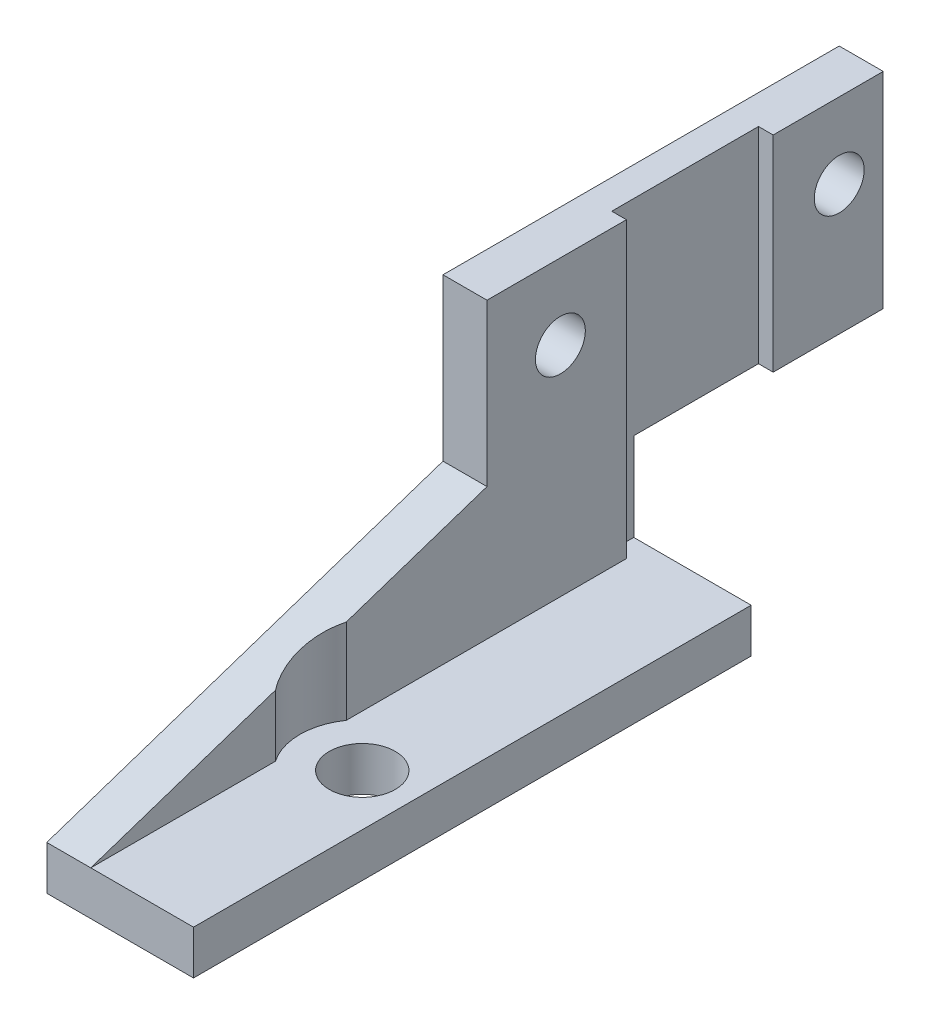
ISO-10303-21;
HEADER;
FILE_DESCRIPTION(('STEP AP214'),'2;1');
FILE_NAME('part.step','',(''),(''),'','','');
FILE_SCHEMA(('AUTOMOTIVE_DESIGN { 1 0 10303 214 1 1 1 1 }'));
ENDSEC;
DATA;
#1=APPLICATION_CONTEXT('core data for automotive mechanical design processes');
#2=APPLICATION_PROTOCOL_DEFINITION('international standard','automotive_design',2000,#1);
#3=PRODUCT_CONTEXT('',#1,'mechanical');
#4=PRODUCT('Part','Part','',(#3));
#5=PRODUCT_RELATED_PRODUCT_CATEGORY('part','',(#4));
#6=PRODUCT_DEFINITION_FORMATION('','',#4);
#7=PRODUCT_DEFINITION_CONTEXT('part definition',#1,'design');
#8=PRODUCT_DEFINITION('design','',#6,#7);
#9=PRODUCT_DEFINITION_SHAPE('','',#8);
#10=(LENGTH_UNIT() NAMED_UNIT(*) SI_UNIT(.MILLI.,.METRE.));
#11=(NAMED_UNIT(*) PLANE_ANGLE_UNIT() SI_UNIT($,.RADIAN.));
#12=(NAMED_UNIT(*) SI_UNIT($,.STERADIAN.) SOLID_ANGLE_UNIT());
#13=UNCERTAINTY_MEASURE_WITH_UNIT(LENGTH_MEASURE(1.E-05),#10,'distance_accuracy_value','');
#14=(GEOMETRIC_REPRESENTATION_CONTEXT(3) GLOBAL_UNCERTAINTY_ASSIGNED_CONTEXT((#13)) GLOBAL_UNIT_ASSIGNED_CONTEXT((#10,
#11,#12)) REPRESENTATION_CONTEXT('',''));
#15=CARTESIAN_POINT('',(0.,0.,0.));
#16=DIRECTION('',(0.,0.,1.));
#17=DIRECTION('',(1.,0.,0.));
#18=AXIS2_PLACEMENT_3D('',#15,#16,#17);
#19=CARTESIAN_POINT('',(3.,20.,27.));
#20=DIRECTION('',(-1.,0.,0.));
#21=DIRECTION('',(0.,-1.,0.));
#22=AXIS2_PLACEMENT_3D('',#19,#20,#21);
#23=PLANE('',#22);
#24=CARTESIAN_POINT('',(3.,14.85,22.));
#25=DIRECTION('',(1.,0.,0.));
#26=DIRECTION('',(0.,1.,0.));
#27=AXIS2_PLACEMENT_3D('',#24,#25,#26);
#28=CIRCLE('',#27,1.7);
#29=CARTESIAN_POINT('',(3.,16.55,22.));
#30=VERTEX_POINT('',#29);
#31=EDGE_CURVE('E236',#30,#30,#28,.T.);
#32=ORIENTED_EDGE('',*,*,#31,.F.);
#33=EDGE_LOOP('',(#32));
#34=FACE_BOUND('',#33,.T.);
#35=DIRECTION('',(0.,-1.,0.));
#36=VECTOR('',#35,1.);
#37=CARTESIAN_POINT('',(3.,20.,36.5890873097518));
#38=LINE('',#37,#36);
#39=CARTESIAN_POINT('',(2.99999999999999,0.,36.5890873097518));
#40=VERTEX_POINT('',#39);
#41=CARTESIAN_POINT('',(3.,5.80363756341608,36.5890873097518));
#42=VERTEX_POINT('',#41);
#43=EDGE_CURVE('E56',#40,#42,#38,.F.);
#44=ORIENTED_EDGE('',*,*,#43,.F.);
#45=DIRECTION('',(0.,0.,-1.));
#46=VECTOR('',#45,1.);
#47=CARTESIAN_POINT('',(2.99999999999999,0.,27.));
#48=LINE('',#47,#46);
#49=CARTESIAN_POINT('',(2.99999999999999,0.,17.5));
#50=VERTEX_POINT('',#49);
#51=EDGE_CURVE('E180',#40,#50,#48,.T.);
#52=ORIENTED_EDGE('',*,*,#51,.T.);
#53=DIRECTION('',(0.,-1.,0.));
#54=VECTOR('',#53,1.);
#55=CARTESIAN_POINT('',(3.,20.,17.5));
#56=LINE('',#55,#54);
#57=CARTESIAN_POINT('',(3.,20.,17.5));
#58=VERTEX_POINT('',#57);
#59=EDGE_CURVE('E221',#58,#50,#56,.T.);
#60=ORIENTED_EDGE('',*,*,#59,.F.);
#61=DIRECTION('',(0.,0.,-1.));
#62=VECTOR('',#61,1.);
#63=CARTESIAN_POINT('',(3.,20.,27.));
#64=LINE('',#63,#62);
#65=CARTESIAN_POINT('',(3.,20.,27.));
#66=VERTEX_POINT('',#65);
#67=EDGE_CURVE('E177',#66,#58,#64,.T.);
#68=ORIENTED_EDGE('',*,*,#67,.F.);
#69=DIRECTION('',(0.,1.,0.));
#70=VECTOR('',#69,1.);
#71=CARTESIAN_POINT('',(3.,20.,27.));
#72=LINE('',#71,#70);
#73=CARTESIAN_POINT('',(3.,9.,27.));
#74=VERTEX_POINT('',#73);
#75=EDGE_CURVE('E169',#74,#66,#72,.T.);
#76=ORIENTED_EDGE('',*,*,#75,.F.);
#77=DIRECTION('',(0.,-0.316227766016838,0.948683298050514));
#78=VECTOR('',#77,1.);
#79=CARTESIAN_POINT('',(3.,9.,27.));
#80=LINE('',#79,#78);
#81=EDGE_CURVE('E224',#74,#42,#80,.T.);
#82=ORIENTED_EDGE('',*,*,#81,.T.);
#83=EDGE_LOOP('',(#44,#52,#60,#68,#76,#82));
#84=FACE_BOUND('',#83,.T.);
#85=ADVANCED_FACE('F33',(#34,#84),#23,.F.);
#86=DIRECTION('',(0.,-1.,0.));
#87=VECTOR('',#86,1.);
#88=CARTESIAN_POINT('',(3.,20.,41.4109126902482));
#89=LINE('',#88,#87);
#90=CARTESIAN_POINT('',(3.,4.19636243658392,41.4109126902482));
#91=VERTEX_POINT('',#90);
#92=CARTESIAN_POINT('',(2.99999999999999,0.,41.4109126902482));
#93=VERTEX_POINT('',#92);
#94=EDGE_CURVE('E269',#91,#93,#89,.T.);
#95=ORIENTED_EDGE('',*,*,#94,.F.);
#96=CARTESIAN_POINT('',(2.99999999999999,0.,54.));
#97=VERTEX_POINT('',#96);
#98=EDGE_CURVE('E287',#91,#97,#80,.T.);
#99=ORIENTED_EDGE('',*,*,#98,.T.);
#100=EDGE_CURVE('E181',#97,#93,#48,.T.);
#101=ORIENTED_EDGE('',*,*,#100,.T.);
#102=EDGE_LOOP('',(#95,#99,#101));
#103=FACE_BOUND('',#102,.T.);
#104=ADVANCED_FACE('F327',(#103),#23,.F.);
#105=CARTESIAN_POINT('',(0.,0.,27.));
#106=DIRECTION('',(0.,0.,-1.));
#107=DIRECTION('',(-1.,0.,0.));
#108=AXIS2_PLACEMENT_3D('',#105,#106,#107);
#109=PLANE('',#108);
#110=DIRECTION('',(-1.,0.,0.));
#111=VECTOR('',#110,1.);
#112=CARTESIAN_POINT('',(32.5465734053883,9.,27.));
#113=LINE('',#112,#111);
#114=CARTESIAN_POINT('',(0.,9.,27.));
#115=VERTEX_POINT('',#114);
#116=EDGE_CURVE('E294',#74,#115,#113,.T.);
#117=ORIENTED_EDGE('',*,*,#116,.F.);
#118=ORIENTED_EDGE('',*,*,#75,.T.);
#119=DIRECTION('',(-1.,0.,0.));
#120=VECTOR('',#119,1.);
#121=CARTESIAN_POINT('',(0.,20.,27.));
#122=LINE('',#121,#120);
#123=CARTESIAN_POINT('',(0.,20.,27.));
#124=VERTEX_POINT('',#123);
#125=EDGE_CURVE('E176',#66,#124,#122,.T.);
#126=ORIENTED_EDGE('',*,*,#125,.T.);
#127=DIRECTION('',(0.,-1.,0.));
#128=VECTOR('',#127,1.);
#129=CARTESIAN_POINT('',(0.,-3.,27.));
#130=LINE('',#129,#128);
#131=EDGE_CURVE('E166',#124,#115,#130,.T.);
#132=ORIENTED_EDGE('',*,*,#131,.T.);
#133=EDGE_LOOP('',(#117,#118,#126,#132));
#134=FACE_BOUND('',#133,.T.);
#135=ADVANCED_FACE('F313',(#134),#109,.F.);
#136=CARTESIAN_POINT('',(10.,-3.,27.));
#137=DIRECTION('',(0.,1.,0.));
#138=DIRECTION('',(0.,0.,1.));
#139=AXIS2_PLACEMENT_3D('',#136,#137,#138);
#140=PLANE('',#139);
#141=CARTESIAN_POINT('',(6.5,-3.,39.));
#142=DIRECTION('',(0.,1.,0.));
#143=DIRECTION('',(0.,0.,1.));
#144=AXIS2_PLACEMENT_3D('',#141,#142,#143);
#145=CIRCLE('',#144,2.25);
#146=CARTESIAN_POINT('',(6.5,-3.,41.25));
#147=VERTEX_POINT('',#146);
#148=EDGE_CURVE('E273',#147,#147,#145,.T.);
#149=ORIENTED_EDGE('',*,*,#148,.T.);
#150=EDGE_LOOP('',(#149));
#151=FACE_BOUND('',#150,.T.);
#152=DIRECTION('',(0.,0.,-1.));
#153=VECTOR('',#152,1.);
#154=CARTESIAN_POINT('',(0.,-3.,27.));
#155=LINE('',#154,#153);
#156=CARTESIAN_POINT('',(0.,-3.,54.));
#157=VERTEX_POINT('',#156);
#158=CARTESIAN_POINT('',(0.,-3.00000000000001,16.));
#159=VERTEX_POINT('',#158);
#160=EDGE_CURVE('E190',#157,#159,#155,.T.);
#161=ORIENTED_EDGE('',*,*,#160,.T.);
#162=DIRECTION('',(1.,0.,0.));
#163=VECTOR('',#162,1.);
#164=CARTESIAN_POINT('',(0.,-3.00000000000001,16.));
#165=LINE('',#164,#163);
#166=CARTESIAN_POINT('',(10.,-3.,16.));
#167=VERTEX_POINT('',#166);
#168=EDGE_CURVE('E200',#159,#167,#165,.T.);
#169=ORIENTED_EDGE('',*,*,#168,.T.);
#170=DIRECTION('',(0.,0.,-1.));
#171=VECTOR('',#170,1.);
#172=CARTESIAN_POINT('',(10.,-3.,27.));
#173=LINE('',#172,#171);
#174=CARTESIAN_POINT('',(10.,-3.,54.));
#175=VERTEX_POINT('',#174);
#176=EDGE_CURVE('E187',#175,#167,#173,.T.);
#177=ORIENTED_EDGE('',*,*,#176,.F.);
#178=DIRECTION('',(-1.,0.,0.));
#179=VECTOR('',#178,1.);
#180=CARTESIAN_POINT('',(32.5465734053883,-3.,54.));
#181=LINE('',#180,#179);
#182=EDGE_CURVE('E293',#175,#157,#181,.T.);
#183=ORIENTED_EDGE('',*,*,#182,.T.);
#184=EDGE_LOOP('',(#161,#169,#177,#183));
#185=FACE_BOUND('',#184,.T.);
#186=ADVANCED_FACE('F35',(#151,#185),#140,.F.);
#187=CARTESIAN_POINT('',(10.,0.,27.));
#188=DIRECTION('',(-1.,0.,0.));
#189=DIRECTION('',(0.,-1.,0.));
#190=AXIS2_PLACEMENT_3D('',#187,#188,#189);
#191=PLANE('',#190);
#192=ORIENTED_EDGE('',*,*,#176,.T.);
#193=DIRECTION('',(0.,-1.,0.));
#194=VECTOR('',#193,1.);
#195=CARTESIAN_POINT('',(10.,-3.,16.));
#196=LINE('',#195,#194);
#197=CARTESIAN_POINT('',(10.,0.,16.));
#198=VERTEX_POINT('',#197);
#199=EDGE_CURVE('E152',#198,#167,#196,.T.);
#200=ORIENTED_EDGE('',*,*,#199,.F.);
#201=DIRECTION('',(0.,0.,-1.));
#202=VECTOR('',#201,1.);
#203=CARTESIAN_POINT('',(10.,0.,27.));
#204=LINE('',#203,#202);
#205=CARTESIAN_POINT('',(10.,0.,54.));
#206=VERTEX_POINT('',#205);
#207=EDGE_CURVE('E184',#206,#198,#204,.T.);
#208=ORIENTED_EDGE('',*,*,#207,.F.);
#209=DIRECTION('',(0.,1.,0.));
#210=VECTOR('',#209,1.);
#211=CARTESIAN_POINT('',(10.,0.,54.));
#212=LINE('',#211,#210);
#213=EDGE_CURVE('E276',#175,#206,#212,.T.);
#214=ORIENTED_EDGE('',*,*,#213,.F.);
#215=EDGE_LOOP('',(#192,#200,#208,#214));
#216=FACE_BOUND('',#215,.T.);
#217=ADVANCED_FACE('F358',(#216),#191,.F.);
#218=CARTESIAN_POINT('',(2.99999999999999,0.,27.));
#219=DIRECTION('',(0.,-1.,0.));
#220=DIRECTION('',(0.,0.,-1.));
#221=AXIS2_PLACEMENT_3D('',#218,#219,#220);
#222=PLANE('',#221);
#223=ORIENTED_EDGE('',*,*,#207,.T.);
#224=DIRECTION('',(-1.,0.,0.));
#225=VECTOR('',#224,1.);
#226=CARTESIAN_POINT('',(2.99999999999999,0.,16.));
#227=LINE('',#226,#225);
#228=CARTESIAN_POINT('',(1.99999999999999,0.,16.));
#229=VERTEX_POINT('',#228);
#230=EDGE_CURVE('E260',#198,#229,#227,.T.);
#231=ORIENTED_EDGE('',*,*,#230,.T.);
#232=DIRECTION('',(0.,0.,-1.));
#233=VECTOR('',#232,1.);
#234=CARTESIAN_POINT('',(1.99999999999999,0.,17.5));
#235=LINE('',#234,#233);
#236=CARTESIAN_POINT('',(1.99999999999999,0.,17.5));
#237=VERTEX_POINT('',#236);
#238=EDGE_CURVE('E206',#237,#229,#235,.T.);
#239=ORIENTED_EDGE('',*,*,#238,.F.);
#240=DIRECTION('',(1.,0.,0.));
#241=VECTOR('',#240,1.);
#242=CARTESIAN_POINT('',(1.99999999999999,0.,17.5));
#243=LINE('',#242,#241);
#244=EDGE_CURVE('E220',#237,#50,#243,.T.);
#245=ORIENTED_EDGE('',*,*,#244,.T.);
#246=ORIENTED_EDGE('',*,*,#51,.F.);
#247=CARTESIAN_POINT('',(6.5,0.,39.));
#248=DIRECTION('',(0.,1.,0.));
#249=DIRECTION('',(0.,0.,1.));
#250=AXIS2_PLACEMENT_3D('',#247,#248,#249);
#251=CIRCLE('',#250,4.25);
#252=EDGE_CURVE('E266',#40,#93,#251,.T.);
#253=ORIENTED_EDGE('',*,*,#252,.T.);
#254=ORIENTED_EDGE('',*,*,#100,.F.);
#255=DIRECTION('',(-1.,0.,0.));
#256=VECTOR('',#255,1.);
#257=CARTESIAN_POINT('',(10.,0.,54.));
#258=LINE('',#257,#256);
#259=EDGE_CURVE('E279',#206,#97,#258,.T.);
#260=ORIENTED_EDGE('',*,*,#259,.F.);
#261=EDGE_LOOP('',(#223,#231,#239,#245,#246,#253,#254,#260));
#262=FACE_BOUND('',#261,.T.);
#263=CARTESIAN_POINT('',(6.5,0.,39.));
#264=DIRECTION('',(0.,1.,0.));
#265=DIRECTION('',(0.,0.,1.));
#266=AXIS2_PLACEMENT_3D('',#263,#264,#265);
#267=CIRCLE('',#266,2.25);
#268=CARTESIAN_POINT('',(6.5,0.,41.25));
#269=VERTEX_POINT('',#268);
#270=EDGE_CURVE('E272',#269,#269,#267,.T.);
#271=ORIENTED_EDGE('',*,*,#270,.F.);
#272=EDGE_LOOP('',(#271));
#273=FACE_BOUND('',#272,.T.);
#274=ADVANCED_FACE('F321',(#262,#273),#222,.F.);
#275=CARTESIAN_POINT('',(3.,14.85,3.));
#276=DIRECTION('',(1.,0.,0.));
#277=DIRECTION('',(0.,1.,0.));
#278=AXIS2_PLACEMENT_3D('',#275,#276,#277);
#279=CIRCLE('',#278,1.7);
#280=CARTESIAN_POINT('',(3.,16.55,3.));
#281=VERTEX_POINT('',#280);
#282=EDGE_CURVE('E228',#281,#281,#279,.T.);
#283=ORIENTED_EDGE('',*,*,#282,.F.);
#284=EDGE_LOOP('',(#283));
#285=FACE_BOUND('',#284,.T.);
#286=DIRECTION('',(0.,1.,0.));
#287=VECTOR('',#286,1.);
#288=CARTESIAN_POINT('',(3.,20.,7.5));
#289=LINE('',#288,#287);
#290=CARTESIAN_POINT('',(3.,6.,7.49999999999999));
#291=VERTEX_POINT('',#290);
#292=CARTESIAN_POINT('',(3.,20.,7.5));
#293=VERTEX_POINT('',#292);
#294=EDGE_CURVE('E215',#291,#293,#289,.T.);
#295=ORIENTED_EDGE('',*,*,#294,.F.);
#296=DIRECTION('',(0.,0.,-1.));
#297=VECTOR('',#296,1.);
#298=CARTESIAN_POINT('',(3.,5.99999999999999,27.));
#299=LINE('',#298,#297);
#300=CARTESIAN_POINT('',(3.,6.,0.));
#301=VERTEX_POINT('',#300);
#302=EDGE_CURVE('E251',#291,#301,#299,.T.);
#303=ORIENTED_EDGE('',*,*,#302,.T.);
#304=DIRECTION('',(0.,1.,0.));
#305=VECTOR('',#304,1.);
#306=CARTESIAN_POINT('',(3.,20.,0.));
#307=LINE('',#306,#305);
#308=CARTESIAN_POINT('',(3.,20.,0.));
#309=VERTEX_POINT('',#308);
#310=EDGE_CURVE('E160',#301,#309,#307,.T.);
#311=ORIENTED_EDGE('',*,*,#310,.T.);
#312=EDGE_CURVE('E175',#293,#309,#64,.T.);
#313=ORIENTED_EDGE('',*,*,#312,.F.);
#314=EDGE_LOOP('',(#295,#303,#311,#313));
#315=FACE_BOUND('',#314,.T.);
#316=ADVANCED_FACE('F250',(#285,#315),#23,.F.);
#317=CARTESIAN_POINT('',(0.,20.,27.));
#318=DIRECTION('',(0.,-1.,0.));
#319=DIRECTION('',(0.,0.,-1.));
#320=AXIS2_PLACEMENT_3D('',#317,#318,#319);
#321=PLANE('',#320);
#322=ORIENTED_EDGE('',*,*,#67,.T.);
#323=DIRECTION('',(1.,0.,0.));
#324=VECTOR('',#323,1.);
#325=CARTESIAN_POINT('',(2.,20.,17.5));
#326=LINE('',#325,#324);
#327=CARTESIAN_POINT('',(2.,20.,17.5));
#328=VERTEX_POINT('',#327);
#329=EDGE_CURVE('E226',#328,#58,#326,.T.);
#330=ORIENTED_EDGE('',*,*,#329,.F.);
#331=DIRECTION('',(0.,0.,1.));
#332=VECTOR('',#331,1.);
#333=CARTESIAN_POINT('',(2.,20.,17.5));
#334=LINE('',#333,#332);
#335=CARTESIAN_POINT('',(2.,20.,7.5));
#336=VERTEX_POINT('',#335);
#337=EDGE_CURVE('E213',#336,#328,#334,.T.);
#338=ORIENTED_EDGE('',*,*,#337,.F.);
#339=DIRECTION('',(1.,0.,0.));
#340=VECTOR('',#339,1.);
#341=CARTESIAN_POINT('',(2.,20.,7.5));
#342=LINE('',#341,#340);
#343=EDGE_CURVE('E229',#336,#293,#342,.T.);
#344=ORIENTED_EDGE('',*,*,#343,.T.);
#345=ORIENTED_EDGE('',*,*,#312,.T.);
#346=DIRECTION('',(-1.,0.,0.));
#347=VECTOR('',#346,1.);
#348=CARTESIAN_POINT('',(0.,20.,0.));
#349=LINE('',#348,#347);
#350=CARTESIAN_POINT('',(0.,20.,0.));
#351=VERTEX_POINT('',#350);
#352=EDGE_CURVE('E167',#309,#351,#349,.T.);
#353=ORIENTED_EDGE('',*,*,#352,.T.);
#354=DIRECTION('',(0.,0.,-1.));
#355=VECTOR('',#354,1.);
#356=CARTESIAN_POINT('',(0.,20.,27.));
#357=LINE('',#356,#355);
#358=EDGE_CURVE('E165',#124,#351,#357,.T.);
#359=ORIENTED_EDGE('',*,*,#358,.F.);
#360=ORIENTED_EDGE('',*,*,#125,.F.);
#361=EDGE_LOOP('',(#322,#330,#338,#344,#345,#353,#359,#360));
#362=FACE_BOUND('',#361,.T.);
#363=ADVANCED_FACE('F253',(#362),#321,.F.);
#364=CARTESIAN_POINT('',(0.,0.,27.));
#365=DIRECTION('',(1.,0.,0.));
#366=DIRECTION('',(0.,1.,0.));
#367=AXIS2_PLACEMENT_3D('',#364,#365,#366);
#368=PLANE('',#367);
#369=CARTESIAN_POINT('',(0.,14.85,22.));
#370=DIRECTION('',(1.,0.,0.));
#371=DIRECTION('',(0.,1.,0.));
#372=AXIS2_PLACEMENT_3D('',#369,#370,#371);
#373=CIRCLE('',#372,1.7);
#374=CARTESIAN_POINT('',(0.,16.55,22.));
#375=VERTEX_POINT('',#374);
#376=EDGE_CURVE('E233',#375,#375,#373,.T.);
#377=ORIENTED_EDGE('',*,*,#376,.T.);
#378=EDGE_LOOP('',(#377));
#379=FACE_BOUND('',#378,.T.);
#380=CARTESIAN_POINT('',(0.,14.85,3.));
#381=DIRECTION('',(1.,0.,0.));
#382=DIRECTION('',(0.,1.,0.));
#383=AXIS2_PLACEMENT_3D('',#380,#381,#382);
#384=CIRCLE('',#383,1.7);
#385=CARTESIAN_POINT('',(0.,16.55,3.));
#386=VERTEX_POINT('',#385);
#387=EDGE_CURVE('E239',#386,#386,#384,.T.);
#388=ORIENTED_EDGE('',*,*,#387,.T.);
#389=EDGE_LOOP('',(#388));
#390=FACE_BOUND('',#389,.T.);
#391=DIRECTION('',(0.,0.,1.));
#392=VECTOR('',#391,1.);
#393=CARTESIAN_POINT('',(0.,5.99999999999999,0.));
#394=LINE('',#393,#392);
#395=CARTESIAN_POINT('',(0.,5.99999999999999,0.));
#396=VERTEX_POINT('',#395);
#397=CARTESIAN_POINT('',(0.,5.99999999999999,16.));
#398=VERTEX_POINT('',#397);
#399=EDGE_CURVE('E140',#396,#398,#394,.T.);
#400=ORIENTED_EDGE('',*,*,#399,.T.);
#401=DIRECTION('',(0.,-1.,0.));
#402=VECTOR('',#401,1.);
#403=CARTESIAN_POINT('',(0.,-3.00000000000001,16.));
#404=LINE('',#403,#402);
#405=EDGE_CURVE('E151',#398,#159,#404,.T.);
#406=ORIENTED_EDGE('',*,*,#405,.T.);
#407=ORIENTED_EDGE('',*,*,#160,.F.);
#408=DIRECTION('',(0.,1.,0.));
#409=VECTOR('',#408,1.);
#410=CARTESIAN_POINT('',(0.,0.,54.));
#411=LINE('',#410,#409);
#412=CARTESIAN_POINT('',(0.,0.,54.));
#413=VERTEX_POINT('',#412);
#414=EDGE_CURVE('E282',#157,#413,#411,.T.);
#415=ORIENTED_EDGE('',*,*,#414,.T.);
#416=DIRECTION('',(0.,0.316227766016838,-0.948683298050514));
#417=VECTOR('',#416,1.);
#418=CARTESIAN_POINT('',(0.,9.,27.));
#419=LINE('',#418,#417);
#420=EDGE_CURVE('E290',#413,#115,#419,.T.);
#421=ORIENTED_EDGE('',*,*,#420,.T.);
#422=ORIENTED_EDGE('',*,*,#131,.F.);
#423=ORIENTED_EDGE('',*,*,#358,.T.);
#424=DIRECTION('',(0.,-1.,0.));
#425=VECTOR('',#424,1.);
#426=CARTESIAN_POINT('',(0.,0.,0.));
#427=LINE('',#426,#425);
#428=EDGE_CURVE('E159',#351,#396,#427,.T.);
#429=ORIENTED_EDGE('',*,*,#428,.T.);
#430=EDGE_LOOP('',(#400,#406,#407,#415,#421,#422,#423,#429));
#431=FACE_BOUND('',#430,.T.);
#432=ADVANCED_FACE('F163',(#379,#390,#431),#368,.F.);
#433=CARTESIAN_POINT('',(0.,0.,0.));
#434=DIRECTION('',(0.,0.,-1.));
#435=DIRECTION('',(-1.,0.,0.));
#436=AXIS2_PLACEMENT_3D('',#433,#434,#435);
#437=PLANE('',#436);
#438=DIRECTION('',(1.,0.,0.));
#439=VECTOR('',#438,1.);
#440=CARTESIAN_POINT('',(0.,5.99999999999999,0.));
#441=LINE('',#440,#439);
#442=EDGE_CURVE('E143',#396,#301,#441,.T.);
#443=ORIENTED_EDGE('',*,*,#442,.F.);
#444=ORIENTED_EDGE('',*,*,#428,.F.);
#445=ORIENTED_EDGE('',*,*,#352,.F.);
#446=ORIENTED_EDGE('',*,*,#310,.F.);
#447=EDGE_LOOP('',(#443,#444,#445,#446));
#448=FACE_BOUND('',#447,.T.);
#449=ADVANCED_FACE('F157',(#448),#437,.T.);
#450=CARTESIAN_POINT('',(0.,14.85,3.));
#451=DIRECTION('',(1.,0.,0.));
#452=DIRECTION('',(0.,1.,0.));
#453=AXIS2_PLACEMENT_3D('',#450,#451,#452);
#454=CYLINDRICAL_SURFACE('',#453,1.7);
#455=ORIENTED_EDGE('',*,*,#387,.F.);
#456=EDGE_LOOP('',(#455));
#457=FACE_BOUND('',#456,.T.);
#458=ORIENTED_EDGE('',*,*,#282,.T.);
#459=EDGE_LOOP('',(#458));
#460=FACE_BOUND('',#459,.T.);
#461=ADVANCED_FACE('F361',(#457,#460),#454,.F.);
#462=CARTESIAN_POINT('',(0.,14.85,22.));
#463=DIRECTION('',(1.,0.,0.));
#464=DIRECTION('',(0.,1.,0.));
#465=AXIS2_PLACEMENT_3D('',#462,#463,#464);
#466=CYLINDRICAL_SURFACE('',#465,1.7);
#467=ORIENTED_EDGE('',*,*,#376,.F.);
#468=EDGE_LOOP('',(#467));
#469=FACE_BOUND('',#468,.T.);
#470=ORIENTED_EDGE('',*,*,#31,.T.);
#471=EDGE_LOOP('',(#470));
#472=FACE_BOUND('',#471,.T.);
#473=ADVANCED_FACE('F363',(#469,#472),#466,.F.);
#474=CARTESIAN_POINT('',(2.,20.,17.5));
#475=DIRECTION('',(0.,0.,1.));
#476=DIRECTION('',(0.,-1.,0.));
#477=AXIS2_PLACEMENT_3D('',#474,#475,#476);
#478=PLANE('',#477);
#479=ORIENTED_EDGE('',*,*,#59,.T.);
#480=ORIENTED_EDGE('',*,*,#244,.F.);
#481=DIRECTION('',(0.,-1.,0.));
#482=VECTOR('',#481,1.);
#483=CARTESIAN_POINT('',(2.,20.,17.5));
#484=LINE('',#483,#482);
#485=EDGE_CURVE('E208',#328,#237,#484,.T.);
#486=ORIENTED_EDGE('',*,*,#485,.F.);
#487=ORIENTED_EDGE('',*,*,#329,.T.);
#488=EDGE_LOOP('',(#479,#480,#486,#487));
#489=FACE_BOUND('',#488,.T.);
#490=ADVANCED_FACE('F319',(#489),#478,.F.);
#491=CARTESIAN_POINT('',(2.,20.,7.5));
#492=DIRECTION('',(0.,0.,-1.));
#493=DIRECTION('',(0.,1.,0.));
#494=AXIS2_PLACEMENT_3D('',#491,#492,#493);
#495=PLANE('',#494);
#496=DIRECTION('',(0.,1.,0.));
#497=VECTOR('',#496,1.);
#498=CARTESIAN_POINT('',(2.,20.,7.5));
#499=LINE('',#498,#497);
#500=CARTESIAN_POINT('',(2.,5.99999999999999,7.49999999999999));
#501=VERTEX_POINT('',#500);
#502=EDGE_CURVE('E211',#501,#336,#499,.T.);
#503=ORIENTED_EDGE('',*,*,#502,.F.);
#504=DIRECTION('',(1.,0.,0.));
#505=VECTOR('',#504,1.);
#506=CARTESIAN_POINT('',(2.,6.,7.49999999999999));
#507=LINE('',#506,#505);
#508=EDGE_CURVE('E48',#501,#291,#507,.T.);
#509=ORIENTED_EDGE('',*,*,#508,.T.);
#510=ORIENTED_EDGE('',*,*,#294,.T.);
#511=ORIENTED_EDGE('',*,*,#343,.F.);
#512=EDGE_LOOP('',(#503,#509,#510,#511));
#513=FACE_BOUND('',#512,.T.);
#514=ADVANCED_FACE('F258',(#513),#495,.F.);
#515=CARTESIAN_POINT('',(1.99999999999999,0.,0.));
#516=DIRECTION('',(1.,0.,0.));
#517=DIRECTION('',(0.,1.,0.));
#518=AXIS2_PLACEMENT_3D('',#515,#516,#517);
#519=PLANE('',#518);
#520=DIRECTION('',(0.,-1.,0.));
#521=VECTOR('',#520,1.);
#522=CARTESIAN_POINT('',(1.99999999999999,0.,16.));
#523=LINE('',#522,#521);
#524=CARTESIAN_POINT('',(2.,5.99999999999999,16.));
#525=VERTEX_POINT('',#524);
#526=EDGE_CURVE('E11',#525,#229,#523,.T.);
#527=ORIENTED_EDGE('',*,*,#526,.F.);
#528=DIRECTION('',(0.,0.,1.));
#529=VECTOR('',#528,1.);
#530=CARTESIAN_POINT('',(2.,6.,0.));
#531=LINE('',#530,#529);
#532=EDGE_CURVE('E41',#501,#525,#531,.T.);
#533=ORIENTED_EDGE('',*,*,#532,.F.);
#534=ORIENTED_EDGE('',*,*,#502,.T.);
#535=ORIENTED_EDGE('',*,*,#337,.T.);
#536=ORIENTED_EDGE('',*,*,#485,.T.);
#537=ORIENTED_EDGE('',*,*,#238,.T.);
#538=EDGE_LOOP('',(#527,#533,#534,#535,#536,#537));
#539=FACE_BOUND('',#538,.T.);
#540=ADVANCED_FACE('F203',(#539),#519,.T.);
#541=CARTESIAN_POINT('',(32.5465734053883,9.,27.));
#542=DIRECTION('',(0.,0.948683298050514,0.316227766016838));
#543=DIRECTION('',(0.,-0.316227766016838,0.948683298050514));
#544=AXIS2_PLACEMENT_3D('',#541,#542,#543);
#545=PLANE('',#544);
#546=ORIENTED_EDGE('',*,*,#98,.F.);
#547=CARTESIAN_POINT('',(6.5,5.,39.));
#548=DIRECTION('',(0.,0.948683298050514,0.316227766016838));
#549=DIRECTION('',(0.,-0.316227766016838,0.948683298050514));
#550=AXIS2_PLACEMENT_3D('',#547,#548,#549);
#551=ELLIPSE('',#550,4.47989335190521,4.25);
#552=EDGE_CURVE('E193',#91,#42,#551,.F.);
#553=ORIENTED_EDGE('',*,*,#552,.T.);
#554=ORIENTED_EDGE('',*,*,#81,.F.);
#555=ORIENTED_EDGE('',*,*,#116,.T.);
#556=ORIENTED_EDGE('',*,*,#420,.F.);
#557=DIRECTION('',(-1.,0.,0.));
#558=VECTOR('',#557,1.);
#559=CARTESIAN_POINT('',(32.5465734053883,0.,54.));
#560=LINE('',#559,#558);
#561=EDGE_CURVE('E297',#97,#413,#560,.T.);
#562=ORIENTED_EDGE('',*,*,#561,.F.);
#563=EDGE_LOOP('',(#546,#553,#554,#555,#556,#562));
#564=FACE_BOUND('',#563,.T.);
#565=ADVANCED_FACE('F309',(#564),#545,.T.);
#566=CARTESIAN_POINT('',(32.5465734053883,0.,54.));
#567=DIRECTION('',(0.,0.,1.));
#568=DIRECTION('',(1.,0.,0.));
#569=AXIS2_PLACEMENT_3D('',#566,#567,#568);
#570=PLANE('',#569);
#571=ORIENTED_EDGE('',*,*,#182,.F.);
#572=ORIENTED_EDGE('',*,*,#213,.T.);
#573=ORIENTED_EDGE('',*,*,#259,.T.);
#574=ORIENTED_EDGE('',*,*,#561,.T.);
#575=ORIENTED_EDGE('',*,*,#414,.F.);
#576=EDGE_LOOP('',(#571,#572,#573,#574,#575));
#577=FACE_BOUND('',#576,.T.);
#578=ADVANCED_FACE('F304',(#577),#570,.T.);
#579=CARTESIAN_POINT('',(6.5,-3.,39.));
#580=DIRECTION('',(0.,1.,0.));
#581=DIRECTION('',(0.,0.,1.));
#582=AXIS2_PLACEMENT_3D('',#579,#580,#581);
#583=CYLINDRICAL_SURFACE('',#582,2.25);
#584=ORIENTED_EDGE('',*,*,#148,.F.);
#585=EDGE_LOOP('',(#584));
#586=FACE_BOUND('',#585,.T.);
#587=ORIENTED_EDGE('',*,*,#270,.T.);
#588=EDGE_LOOP('',(#587));
#589=FACE_BOUND('',#588,.T.);
#590=ADVANCED_FACE('F330',(#586,#589),#583,.F.);
#591=CARTESIAN_POINT('',(6.5,20.,39.));
#592=DIRECTION('',(0.,-1.,0.));
#593=DIRECTION('',(0.,0.,-1.));
#594=AXIS2_PLACEMENT_3D('',#591,#592,#593);
#595=CYLINDRICAL_SURFACE('',#594,4.25);
#596=ORIENTED_EDGE('',*,*,#43,.T.);
#597=ORIENTED_EDGE('',*,*,#552,.F.);
#598=ORIENTED_EDGE('',*,*,#94,.T.);
#599=ORIENTED_EDGE('',*,*,#252,.F.);
#600=EDGE_LOOP('',(#596,#597,#598,#599));
#601=FACE_BOUND('',#600,.T.);
#602=ADVANCED_FACE('F328',(#601),#595,.F.);
#603=CARTESIAN_POINT('',(0.,-3.00000000000001,16.));
#604=DIRECTION('',(0.,0.,1.));
#605=DIRECTION('',(1.,0.,0.));
#606=AXIS2_PLACEMENT_3D('',#603,#604,#605);
#607=PLANE('',#606);
#608=ORIENTED_EDGE('',*,*,#199,.T.);
#609=ORIENTED_EDGE('',*,*,#168,.F.);
#610=ORIENTED_EDGE('',*,*,#405,.F.);
#611=DIRECTION('',(1.,0.,0.));
#612=VECTOR('',#611,1.);
#613=CARTESIAN_POINT('',(0.,5.99999999999999,16.));
#614=LINE('',#613,#612);
#615=EDGE_CURVE('E146',#398,#525,#614,.T.);
#616=ORIENTED_EDGE('',*,*,#615,.T.);
#617=ORIENTED_EDGE('',*,*,#526,.T.);
#618=ORIENTED_EDGE('',*,*,#230,.F.);
#619=EDGE_LOOP('',(#608,#609,#610,#616,#617,#618));
#620=FACE_BOUND('',#619,.T.);
#621=ADVANCED_FACE('F198',(#620),#607,.F.);
#622=CARTESIAN_POINT('',(0.,5.99999999999999,0.));
#623=DIRECTION('',(0.,1.,0.));
#624=DIRECTION('',(-1.,0.,0.));
#625=AXIS2_PLACEMENT_3D('',#622,#623,#624);
#626=PLANE('',#625);
#627=ORIENTED_EDGE('',*,*,#508,.F.);
#628=ORIENTED_EDGE('',*,*,#532,.T.);
#629=ORIENTED_EDGE('',*,*,#615,.F.);
#630=ORIENTED_EDGE('',*,*,#399,.F.);
#631=ORIENTED_EDGE('',*,*,#442,.T.);
#632=ORIENTED_EDGE('',*,*,#302,.F.);
#633=EDGE_LOOP('',(#627,#628,#629,#630,#631,#632));
#634=FACE_BOUND('',#633,.T.);
#635=ADVANCED_FACE('F142',(#634),#626,.F.);
#636=CLOSED_SHELL('',(#85,#104,#135,#186,#217,#274,#316,#363,#432,#449,#461,#473,#490,#514,#540,
#565,#578,#590,#602,#621,#635));
#637=MANIFOLD_SOLID_BREP('B2',#636);
#638=ADVANCED_BREP_SHAPE_REPRESENTATION('',(#18,#637),#14);
#639=SHAPE_DEFINITION_REPRESENTATION(#9,#638);
ENDSEC;
END-ISO-10303-21;
